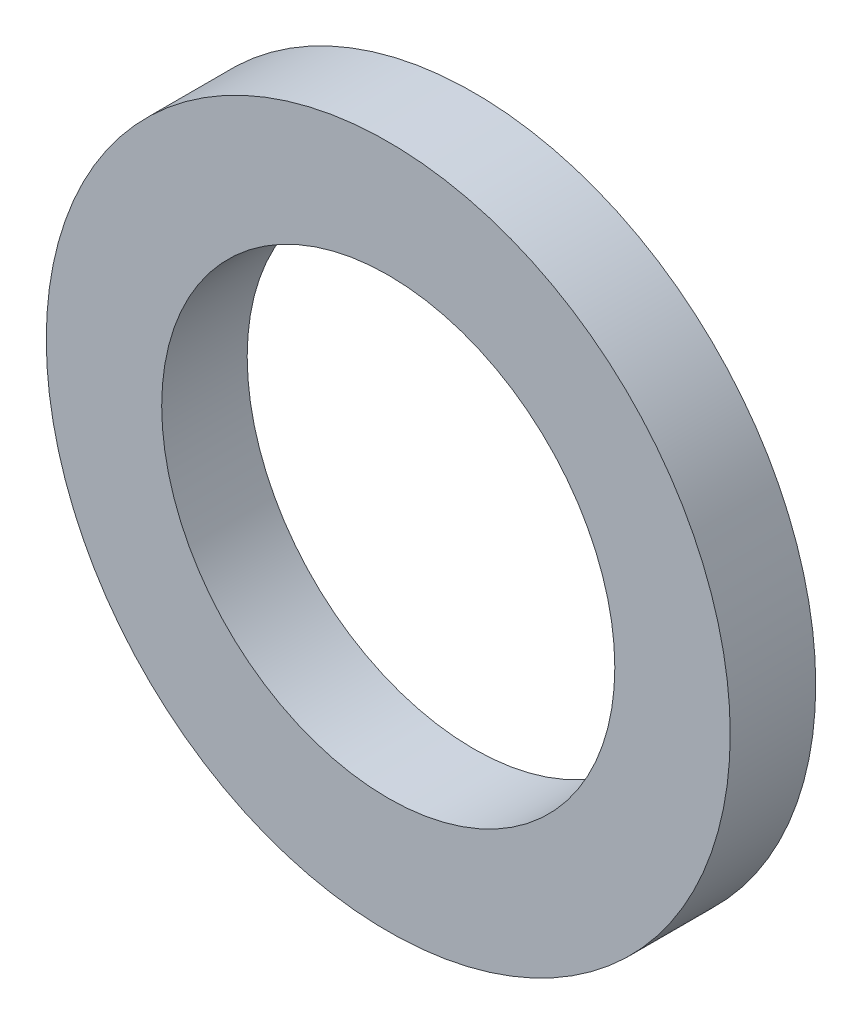
ISO-10303-21;
HEADER;
FILE_DESCRIPTION(('STEP AP214'),'2;1');
FILE_NAME('part.step','',(''),(''),'','','');
FILE_SCHEMA(('AUTOMOTIVE_DESIGN { 1 0 10303 214 1 1 1 1 }'));
ENDSEC;
DATA;
#1=APPLICATION_CONTEXT('core data for automotive mechanical design processes');
#2=APPLICATION_PROTOCOL_DEFINITION('international standard','automotive_design',2000,#1);
#3=PRODUCT_CONTEXT('',#1,'mechanical');
#4=PRODUCT('Part','Part','',(#3));
#5=PRODUCT_RELATED_PRODUCT_CATEGORY('part','',(#4));
#6=PRODUCT_DEFINITION_FORMATION('','',#4);
#7=PRODUCT_DEFINITION_CONTEXT('part definition',#1,'design');
#8=PRODUCT_DEFINITION('design','',#6,#7);
#9=PRODUCT_DEFINITION_SHAPE('','',#8);
#10=(LENGTH_UNIT() NAMED_UNIT(*) SI_UNIT(.MILLI.,.METRE.));
#11=(NAMED_UNIT(*) PLANE_ANGLE_UNIT() SI_UNIT($,.RADIAN.));
#12=(NAMED_UNIT(*) SI_UNIT($,.STERADIAN.) SOLID_ANGLE_UNIT());
#13=UNCERTAINTY_MEASURE_WITH_UNIT(LENGTH_MEASURE(1.E-05),#10,'distance_accuracy_value','');
#14=(GEOMETRIC_REPRESENTATION_CONTEXT(3) GLOBAL_UNCERTAINTY_ASSIGNED_CONTEXT((#13)) GLOBAL_UNIT_ASSIGNED_CONTEXT((#10,
#11,#12)) REPRESENTATION_CONTEXT('',''));
#15=CARTESIAN_POINT('',(0.,0.,0.));
#16=DIRECTION('',(0.,0.,1.));
#17=DIRECTION('',(1.,0.,0.));
#18=AXIS2_PLACEMENT_3D('',#15,#16,#17);
#19=CARTESIAN_POINT('',(0.,0.,1.));
#20=DIRECTION('',(0.,0.,-1.));
#21=DIRECTION('',(-1.,0.,0.));
#22=AXIS2_PLACEMENT_3D('',#19,#20,#21);
#23=CYLINDRICAL_SURFACE('',#22,4.);
#24=CARTESIAN_POINT('',(0.,0.,1.));
#25=DIRECTION('',(0.,0.,1.));
#26=DIRECTION('',(1.,0.,0.));
#27=AXIS2_PLACEMENT_3D('',#24,#25,#26);
#28=CIRCLE('',#27,4.);
#29=CARTESIAN_POINT('',(4.,0.,1.));
#30=VERTEX_POINT('',#29);
#31=EDGE_CURVE('E10',#30,#30,#28,.T.);
#32=ORIENTED_EDGE('',*,*,#31,.F.);
#33=EDGE_LOOP('',(#32));
#34=FACE_BOUND('',#33,.T.);
#35=CARTESIAN_POINT('',(0.,0.,0.));
#36=DIRECTION('',(0.,0.,1.));
#37=DIRECTION('',(1.,0.,0.));
#38=AXIS2_PLACEMENT_3D('',#35,#36,#37);
#39=CIRCLE('',#38,4.);
#40=CARTESIAN_POINT('',(4.,0.,0.));
#41=VERTEX_POINT('',#40);
#42=EDGE_CURVE('E44',#41,#41,#39,.T.);
#43=ORIENTED_EDGE('',*,*,#42,.T.);
#44=EDGE_LOOP('',(#43));
#45=FACE_BOUND('',#44,.T.);
#46=ADVANCED_FACE('F41',(#34,#45),#23,.T.);
#47=CARTESIAN_POINT('',(0.,0.,1.));
#48=DIRECTION('',(0.,0.,1.));
#49=DIRECTION('',(1.,0.,0.));
#50=AXIS2_PLACEMENT_3D('',#47,#48,#49);
#51=PLANE('',#50);
#52=CARTESIAN_POINT('',(0.,0.,1.));
#53=DIRECTION('',(0.,0.,1.));
#54=DIRECTION('',(1.,0.,0.));
#55=AXIS2_PLACEMENT_3D('',#52,#53,#54);
#56=CIRCLE('',#55,2.65);
#57=CARTESIAN_POINT('',(2.65,0.,1.));
#58=VERTEX_POINT('',#57);
#59=EDGE_CURVE('E58',#58,#58,#56,.T.);
#60=ORIENTED_EDGE('',*,*,#59,.F.);
#61=EDGE_LOOP('',(#60));
#62=FACE_BOUND('',#61,.T.);
#63=ORIENTED_EDGE('',*,*,#31,.T.);
#64=EDGE_LOOP('',(#63));
#65=FACE_BOUND('',#64,.T.);
#66=ADVANCED_FACE('F66',(#62,#65),#51,.T.);
#67=CARTESIAN_POINT('',(0.,0.,0.));
#68=DIRECTION('',(0.,0.,1.));
#69=DIRECTION('',(1.,0.,0.));
#70=AXIS2_PLACEMENT_3D('',#67,#68,#69);
#71=PLANE('',#70);
#72=CARTESIAN_POINT('',(0.,0.,0.));
#73=DIRECTION('',(0.,0.,1.));
#74=DIRECTION('',(1.,0.,0.));
#75=AXIS2_PLACEMENT_3D('',#72,#73,#74);
#76=CIRCLE('',#75,2.65);
#77=CARTESIAN_POINT('',(2.65,0.,0.));
#78=VERTEX_POINT('',#77);
#79=EDGE_CURVE('E53',#78,#78,#76,.F.);
#80=ORIENTED_EDGE('',*,*,#79,.F.);
#81=EDGE_LOOP('',(#80));
#82=FACE_BOUND('',#81,.T.);
#83=ORIENTED_EDGE('',*,*,#42,.F.);
#84=EDGE_LOOP('',(#83));
#85=FACE_BOUND('',#84,.T.);
#86=ADVANCED_FACE('F68',(#82,#85),#71,.F.);
#87=CARTESIAN_POINT('',(0.,0.,-0.000999999999999916));
#88=DIRECTION('',(0.,0.,1.));
#89=DIRECTION('',(1.,0.,0.));
#90=AXIS2_PLACEMENT_3D('',#87,#88,#89);
#91=CYLINDRICAL_SURFACE('',#90,2.65);
#92=ORIENTED_EDGE('',*,*,#59,.T.);
#93=EDGE_LOOP('',(#92));
#94=FACE_BOUND('',#93,.T.);
#95=ORIENTED_EDGE('',*,*,#79,.T.);
#96=EDGE_LOOP('',(#95));
#97=FACE_BOUND('',#96,.T.);
#98=ADVANCED_FACE('F63',(#94,#97),#91,.F.);
#99=CLOSED_SHELL('',(#46,#66,#86,#98));
#100=MANIFOLD_SOLID_BREP('B2',#99);
#101=ADVANCED_BREP_SHAPE_REPRESENTATION('',(#18,#100),#14);
#102=SHAPE_DEFINITION_REPRESENTATION(#9,#101);
ENDSEC;
END-ISO-10303-21;
